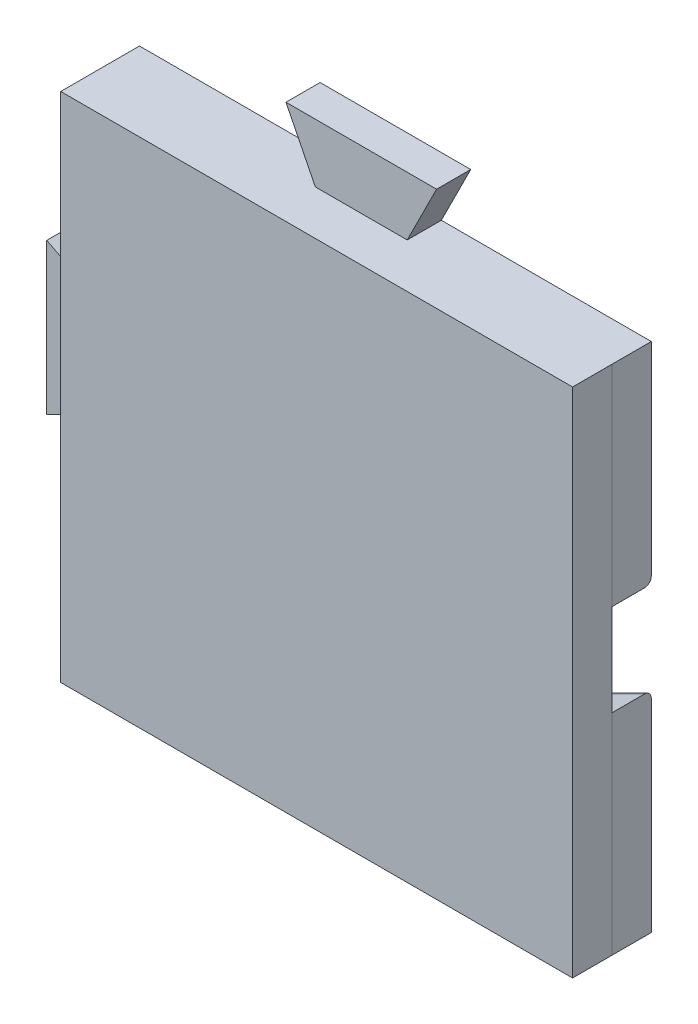
ISO-10303-21;
HEADER;
FILE_DESCRIPTION(('STEP AP214'),'2;1');
FILE_NAME('part.step','',(''),(''),'','','');
FILE_SCHEMA(('AUTOMOTIVE_DESIGN { 1 0 10303 214 1 1 1 1 }'));
ENDSEC;
DATA;
#1=APPLICATION_CONTEXT('core data for automotive mechanical design processes');
#2=APPLICATION_PROTOCOL_DEFINITION('international standard','automotive_design',2000,#1);
#3=PRODUCT_CONTEXT('',#1,'mechanical');
#4=PRODUCT('Part','Part','',(#3));
#5=PRODUCT_RELATED_PRODUCT_CATEGORY('part','',(#4));
#6=PRODUCT_DEFINITION_FORMATION('','',#4);
#7=PRODUCT_DEFINITION_CONTEXT('part definition',#1,'design');
#8=PRODUCT_DEFINITION('design','',#6,#7);
#9=PRODUCT_DEFINITION_SHAPE('','',#8);
#10=(LENGTH_UNIT() NAMED_UNIT(*) SI_UNIT(.MILLI.,.METRE.));
#11=(NAMED_UNIT(*) PLANE_ANGLE_UNIT() SI_UNIT($,.RADIAN.));
#12=(NAMED_UNIT(*) SI_UNIT($,.STERADIAN.) SOLID_ANGLE_UNIT());
#13=UNCERTAINTY_MEASURE_WITH_UNIT(LENGTH_MEASURE(1.E-05),#10,'distance_accuracy_value','');
#14=(GEOMETRIC_REPRESENTATION_CONTEXT(3) GLOBAL_UNCERTAINTY_ASSIGNED_CONTEXT((#13)) GLOBAL_UNIT_ASSIGNED_CONTEXT((#10,
#11,#12)) REPRESENTATION_CONTEXT('',''));
#15=CARTESIAN_POINT('',(0.,0.,0.));
#16=DIRECTION('',(0.,0.,1.));
#17=DIRECTION('',(1.,0.,0.));
#18=AXIS2_PLACEMENT_3D('',#15,#16,#17);
#19=CARTESIAN_POINT('',(17.2646144079016,21.7353855920973,0.));
#20=DIRECTION('',(0.,0.,1.));
#21=DIRECTION('',(1.,0.,0.));
#22=AXIS2_PLACEMENT_3D('',#19,#20,#21);
#23=PLANE('',#22);
#24=CARTESIAN_POINT('',(19.5,19.5,0.));
#25=DIRECTION('',(0.,0.,1.));
#26=DIRECTION('',(1.,0.,0.));
#27=AXIS2_PLACEMENT_3D('',#24,#25,#26);
#28=CIRCLE('',#27,7.57);
#29=CARTESIAN_POINT('',(11.93,19.5,0.));
#30=VERTEX_POINT('',#29);
#31=EDGE_CURVE('E321',#30,#30,#28,.T.);
#32=ORIENTED_EDGE('',*,*,#31,.T.);
#33=EDGE_LOOP('',(#32));
#34=FACE_BOUND('',#33,.T.);
#35=DIRECTION('',(-0.894154236839191,-0.447759087839123,0.));
#36=VECTOR('',#35,1.);
#37=CARTESIAN_POINT('',(31.6831566125795,11.7768102088134,0.));
#38=LINE('',#37,#36);
#39=CARTESIAN_POINT('',(38.9999998356643,15.4408123601777,0.));
#40=VERTEX_POINT('',#39);
#41=CARTESIAN_POINT('',(34.0292285710155,12.9516355318221,0.));
#42=VERTEX_POINT('',#41);
#43=EDGE_CURVE('E384',#40,#42,#38,.T.);
#44=ORIENTED_EDGE('',*,*,#43,.F.);
#45=DIRECTION('',(-1.06429420831944E-08,1.,0.));
#46=VECTOR('',#45,1.);
#47=CARTESIAN_POINT('',(39.,0.,0.));
#48=LINE('',#47,#46);
#49=CARTESIAN_POINT('',(39.,0.,0.));
#50=VERTEX_POINT('',#49);
#51=EDGE_CURVE('E536',#50,#40,#48,.T.);
#52=ORIENTED_EDGE('',*,*,#51,.F.);
#53=DIRECTION('',(1.,0.,0.));
#54=VECTOR('',#53,1.);
#55=CARTESIAN_POINT('',(23.,0.,0.));
#56=LINE('',#55,#54);
#57=CARTESIAN_POINT('',(23.5591876428024,0.,0.));
#58=VERTEX_POINT('',#57);
#59=EDGE_CURVE('E19',#58,#50,#56,.T.);
#60=ORIENTED_EDGE('',*,*,#59,.F.);
#61=DIRECTION('',(-0.44775908783877,-0.894154236839368,0.));
#62=VECTOR('',#61,1.);
#63=CARTESIAN_POINT('',(28.3425875448702,9.5522288773087,0.));
#64=LINE('',#63,#62);
#65=CARTESIAN_POINT('',(26.0483644308682,4.97077118419684,0.));
#66=VERTEX_POINT('',#65);
#67=EDGE_CURVE('E434',#66,#58,#64,.T.);
#68=ORIENTED_EDGE('',*,*,#67,.F.);
#69=DIRECTION('',(1.,0.,0.));
#70=VECTOR('',#69,1.);
#71=CARTESIAN_POINT('',(15.5129096035632,4.97077118419684,0.));
#72=LINE('',#71,#70);
#73=CARTESIAN_POINT('',(12.9516358075504,4.97077118419684,0.));
#74=VERTEX_POINT('',#73);
#75=EDGE_CURVE('E495',#74,#66,#72,.T.);
#76=ORIENTED_EDGE('',*,*,#75,.F.);
#77=DIRECTION('',(-0.44775908783877,0.894154236839368,0.));
#78=VECTOR('',#77,1.);
#79=CARTESIAN_POINT('',(11.3286419539204,8.21181501781761,0.));
#80=LINE('',#79,#78);
#81=CARTESIAN_POINT('',(15.4408125956162,0.,0.));
#82=VERTEX_POINT('',#81);
#83=EDGE_CURVE('E315',#82,#74,#80,.T.);
#84=ORIENTED_EDGE('',*,*,#83,.F.);
#85=DIRECTION('',(1.,0.,0.));
#86=VECTOR('',#85,1.);
#87=CARTESIAN_POINT('',(0.,0.,0.));
#88=LINE('',#87,#86);
#89=CARTESIAN_POINT('',(0.,0.,0.));
#90=VERTEX_POINT('',#89);
#91=EDGE_CURVE('E11',#90,#82,#88,.T.);
#92=ORIENTED_EDGE('',*,*,#91,.F.);
#93=DIRECTION('',(0.,-1.,0.));
#94=VECTOR('',#93,1.);
#95=CARTESIAN_POINT('',(0.,16.,0.));
#96=LINE('',#95,#94);
#97=CARTESIAN_POINT('',(0.,16.,0.));
#98=VERTEX_POINT('',#97);
#99=EDGE_CURVE('E525',#98,#90,#96,.T.);
#100=ORIENTED_EDGE('',*,*,#99,.F.);
#101=DIRECTION('',(-0.894154236839368,-0.447759087838769,0.));
#102=VECTOR('',#101,1.);
#103=CARTESIAN_POINT('',(0.,16.,0.));
#104=LINE('',#103,#102);
#105=CARTESIAN_POINT('',(-4.47077118419684,13.7612045608062,0.));
#106=VERTEX_POINT('',#105);
#107=EDGE_CURVE('E254',#98,#106,#104,.T.);
#108=ORIENTED_EDGE('',*,*,#107,.T.);
#109=DIRECTION('',(0.,1.,0.));
#110=VECTOR('',#109,1.);
#111=CARTESIAN_POINT('',(-4.47077118419684,13.7612045608062,0.));
#112=LINE('',#111,#110);
#113=CARTESIAN_POINT('',(-4.47077118419684,25.2387954391939,0.));
#114=VERTEX_POINT('',#113);
#115=EDGE_CURVE('E349',#106,#114,#112,.T.);
#116=ORIENTED_EDGE('',*,*,#115,.T.);
#117=DIRECTION('',(0.894154236839367,-0.447759087838771,0.));
#118=VECTOR('',#117,1.);
#119=CARTESIAN_POINT('',(-4.47077118419684,25.2387954391939,0.));
#120=LINE('',#119,#118);
#121=CARTESIAN_POINT('',(0.,23.,0.));
#122=VERTEX_POINT('',#121);
#123=EDGE_CURVE('E363',#114,#122,#120,.T.);
#124=ORIENTED_EDGE('',*,*,#123,.T.);
#125=DIRECTION('',(0.,-1.,0.));
#126=VECTOR('',#125,1.);
#127=CARTESIAN_POINT('',(0.,39.,0.));
#128=LINE('',#127,#126);
#129=CARTESIAN_POINT('',(0.,39.,0.));
#130=VERTEX_POINT('',#129);
#131=EDGE_CURVE('E367',#130,#122,#128,.T.);
#132=ORIENTED_EDGE('',*,*,#131,.F.);
#133=DIRECTION('',(-1.,0.,0.));
#134=VECTOR('',#133,1.);
#135=CARTESIAN_POINT('',(16.,39.,0.));
#136=LINE('',#135,#134);
#137=CARTESIAN_POINT('',(16.,39.,0.));
#138=VERTEX_POINT('',#137);
#139=EDGE_CURVE('E466',#138,#130,#136,.T.);
#140=ORIENTED_EDGE('',*,*,#139,.F.);
#141=DIRECTION('',(-0.447759087839646,0.894154236838929,0.));
#142=VECTOR('',#141,1.);
#143=CARTESIAN_POINT('',(16.,39.,0.));
#144=LINE('',#143,#142);
#145=CARTESIAN_POINT('',(13.7612045608018,43.4707711841946,0.));
#146=VERTEX_POINT('',#145);
#147=EDGE_CURVE('E304',#138,#146,#144,.T.);
#148=ORIENTED_EDGE('',*,*,#147,.T.);
#149=DIRECTION('',(1.,0.,0.));
#150=VECTOR('',#149,1.);
#151=CARTESIAN_POINT('',(13.7612045608018,43.4707711841946,0.));
#152=LINE('',#151,#150);
#153=CARTESIAN_POINT('',(25.238795024118,43.4707711841946,0.));
#154=VERTEX_POINT('',#153);
#155=EDGE_CURVE('E46',#146,#154,#152,.T.);
#156=ORIENTED_EDGE('',*,*,#155,.T.);
#157=DIRECTION('',(-0.447759087838771,-0.894154236839368,0.));
#158=VECTOR('',#157,1.);
#159=CARTESIAN_POINT('',(25.238795024118,43.4707711841946,0.));
#160=LINE('',#159,#158);
#161=CARTESIAN_POINT('',(22.9999995849252,39.,0.));
#162=VERTEX_POINT('',#161);
#163=EDGE_CURVE('E291',#154,#162,#160,.T.);
#164=ORIENTED_EDGE('',*,*,#163,.T.);
#165=DIRECTION('',(-1.,0.,0.));
#166=VECTOR('',#165,1.);
#167=CARTESIAN_POINT('',(38.9999995849253,39.,0.));
#168=LINE('',#167,#166);
#169=CARTESIAN_POINT('',(38.9999995849253,39.,0.));
#170=VERTEX_POINT('',#169);
#171=EDGE_CURVE('E288',#170,#162,#168,.T.);
#172=ORIENTED_EDGE('',*,*,#171,.F.);
#173=DIRECTION('',(-1.06429422286385E-08,1.,0.));
#174=VECTOR('',#173,1.);
#175=CARTESIAN_POINT('',(38.9999997552123,22.9999998013909,0.));
#176=LINE('',#175,#174);
#177=CARTESIAN_POINT('',(38.9999997492609,23.5591874471735,0.));
#178=VERTEX_POINT('',#177);
#179=EDGE_CURVE('E484',#178,#170,#176,.T.);
#180=ORIENTED_EDGE('',*,*,#179,.F.);
#181=DIRECTION('',(0.894154236839368,-0.44775908783877,0.));
#182=VECTOR('',#181,1.);
#183=CARTESIAN_POINT('',(28.5527992511206,28.7907557524931,0.));
#184=LINE('',#183,#182);
#185=CARTESIAN_POINT('',(34.0292285710155,26.0483642322591,0.));
#186=VERTEX_POINT('',#185);
#187=EDGE_CURVE('E454',#186,#178,#184,.T.);
#188=ORIENTED_EDGE('',*,*,#187,.F.);
#189=DIRECTION('',(0.,1.,0.));
#190=VECTOR('',#189,1.);
#191=CARTESIAN_POINT('',(34.0292285710155,17.7482950577971,0.));
#192=LINE('',#191,#190);
#193=EDGE_CURVE('E433',#42,#186,#192,.T.);
#194=ORIENTED_EDGE('',*,*,#193,.F.);
#195=EDGE_LOOP('',(#44,#52,#60,#68,#76,#84,#92,#100,#108,#116,#124,#132,#140,#148,#156,#164,
#172,#180,#188,#194));
#196=FACE_BOUND('',#195,.T.);
#197=ADVANCED_FACE('F16',(#34,#196),#23,.F.);
#198=CARTESIAN_POINT('',(0.,0.,0.));
#199=DIRECTION('',(0.,-1.,0.));
#200=DIRECTION('',(0.,0.,-1.));
#201=AXIS2_PLACEMENT_3D('',#198,#199,#200);
#202=PLANE('',#201);
#203=CARTESIAN_POINT('',(15.4408125956162,0.,0.5));
#204=DIRECTION('',(0.,1.,0.));
#205=DIRECTION('',(1.,0.,0.));
#206=AXIS2_PLACEMENT_3D('',#203,#204,#205);
#207=ELLIPSE('',#206,0.559187642802417,0.5);
#208=CARTESIAN_POINT('',(16.0000002384186,0.,0.5));
#209=VERTEX_POINT('',#208);
#210=EDGE_CURVE('E339',#209,#82,#207,.T.);
#211=ORIENTED_EDGE('',*,*,#210,.F.);
#212=DIRECTION('',(0.,0.,1.));
#213=VECTOR('',#212,1.);
#214=CARTESIAN_POINT('',(16.0000002384186,0.,0.));
#215=LINE('',#214,#213);
#216=CARTESIAN_POINT('',(16.0000002384186,0.,3.));
#217=VERTEX_POINT('',#216);
#218=EDGE_CURVE('E491',#209,#217,#215,.T.);
#219=ORIENTED_EDGE('',*,*,#218,.T.);
#220=DIRECTION('',(-1.,0.,0.));
#221=VECTOR('',#220,1.);
#222=CARTESIAN_POINT('',(39.,0.,3.));
#223=LINE('',#222,#221);
#224=CARTESIAN_POINT('',(23.,0.,3.));
#225=VERTEX_POINT('',#224);
#226=EDGE_CURVE('E368',#225,#217,#223,.T.);
#227=ORIENTED_EDGE('',*,*,#226,.F.);
#228=DIRECTION('',(0.,0.,1.));
#229=VECTOR('',#228,1.);
#230=CARTESIAN_POINT('',(23.,0.,0.));
#231=LINE('',#230,#229);
#232=CARTESIAN_POINT('',(23.,0.,0.5));
#233=VERTEX_POINT('',#232);
#234=EDGE_CURVE('E350',#233,#225,#231,.T.);
#235=ORIENTED_EDGE('',*,*,#234,.F.);
#236=CARTESIAN_POINT('',(23.5591876428024,0.,0.5));
#237=DIRECTION('',(0.,1.,0.));
#238=DIRECTION('',(-1.,0.,0.));
#239=AXIS2_PLACEMENT_3D('',#236,#237,#238);
#240=ELLIPSE('',#239,0.559187642802417,0.5);
#241=EDGE_CURVE('E438',#58,#233,#240,.T.);
#242=ORIENTED_EDGE('',*,*,#241,.F.);
#243=ORIENTED_EDGE('',*,*,#59,.T.);
#244=DIRECTION('',(0.,0.,1.));
#245=VECTOR('',#244,1.);
#246=CARTESIAN_POINT('',(39.,0.,0.));
#247=LINE('',#246,#245);
#248=CARTESIAN_POINT('',(39.,0.,3.));
#249=VERTEX_POINT('',#248);
#250=EDGE_CURVE('E528',#50,#249,#247,.T.);
#251=ORIENTED_EDGE('',*,*,#250,.T.);
#252=DIRECTION('',(0.,0.,1.));
#253=VECTOR('',#252,1.);
#254=CARTESIAN_POINT('',(39.,0.,3.));
#255=LINE('',#254,#253);
#256=CARTESIAN_POINT('',(39.,0.,6.));
#257=VERTEX_POINT('',#256);
#258=EDGE_CURVE('E401',#249,#257,#255,.T.);
#259=ORIENTED_EDGE('',*,*,#258,.T.);
#260=DIRECTION('',(1.,0.,0.));
#261=VECTOR('',#260,1.);
#262=CARTESIAN_POINT('',(39.,0.,6.));
#263=LINE('',#262,#261);
#264=CARTESIAN_POINT('',(0.,0.,6.));
#265=VERTEX_POINT('',#264);
#266=EDGE_CURVE('E407',#265,#257,#263,.T.);
#267=ORIENTED_EDGE('',*,*,#266,.F.);
#268=DIRECTION('',(0.,0.,1.));
#269=VECTOR('',#268,1.);
#270=CARTESIAN_POINT('',(0.,0.,0.));
#271=LINE('',#270,#269);
#272=EDGE_CURVE('E531',#90,#265,#271,.T.);
#273=ORIENTED_EDGE('',*,*,#272,.F.);
#274=ORIENTED_EDGE('',*,*,#91,.T.);
#275=EDGE_LOOP('',(#211,#219,#227,#235,#242,#243,#251,#259,#267,#273,#274));
#276=FACE_BOUND('',#275,.T.);
#277=ADVANCED_FACE('F560',(#276),#202,.T.);
#278=CARTESIAN_POINT('',(39.,0.,0.));
#279=DIRECTION('',(1.,1.06429420831944E-08,0.));
#280=DIRECTION('',(0.,0.,-1.));
#281=AXIS2_PLACEMENT_3D('',#278,#279,#280);
#282=PLANE('',#281);
#283=CARTESIAN_POINT('',(38.9999998356643,15.4408123601777,0.5));
#284=DIRECTION('',(-1.,-1.06429420730383E-08,0.));
#285=DIRECTION('',(-1.06429420730383E-08,1.,0.));
#286=AXIS2_PLACEMENT_3D('',#283,#284,#285);
#287=ELLIPSE('',#286,0.559187639822287,0.5);
#288=CARTESIAN_POINT('',(38.9999998297129,16.,0.5));
#289=VERTEX_POINT('',#288);
#290=EDGE_CURVE('E389',#289,#40,#287,.T.);
#291=ORIENTED_EDGE('',*,*,#290,.F.);
#292=DIRECTION('',(0.,0.,1.));
#293=VECTOR('',#292,1.);
#294=CARTESIAN_POINT('',(38.9999998297129,16.,0.));
#295=LINE('',#294,#293);
#296=CARTESIAN_POINT('',(38.9999998297129,16.,3.));
#297=VERTEX_POINT('',#296);
#298=EDGE_CURVE('E458',#289,#297,#295,.T.);
#299=ORIENTED_EDGE('',*,*,#298,.T.);
#300=DIRECTION('',(-1.06429420831944E-08,1.,0.));
#301=VECTOR('',#300,1.);
#302=CARTESIAN_POINT('',(39.,0.,3.));
#303=LINE('',#302,#301);
#304=EDGE_CURVE('E411',#249,#297,#303,.T.);
#305=ORIENTED_EDGE('',*,*,#304,.F.);
#306=ORIENTED_EDGE('',*,*,#250,.F.);
#307=ORIENTED_EDGE('',*,*,#51,.T.);
#308=EDGE_LOOP('',(#291,#299,#305,#306,#307));
#309=FACE_BOUND('',#308,.T.);
#310=ADVANCED_FACE('F568',(#309),#282,.T.);
#311=CARTESIAN_POINT('',(25.238795024118,43.4707711841946,0.));
#312=DIRECTION('',(0.,1.,0.));
#313=DIRECTION('',(1.,0.,0.));
#314=AXIS2_PLACEMENT_3D('',#311,#312,#313);
#315=PLANE('',#314);
#316=DIRECTION('',(1.,0.,0.));
#317=VECTOR('',#316,1.);
#318=CARTESIAN_POINT('',(22.3693974082889,43.4707711841946,2.6));
#319=LINE('',#318,#317);
#320=CARTESIAN_POINT('',(13.7612045608018,43.4707711841946,2.6));
#321=VERTEX_POINT('',#320);
#322=CARTESIAN_POINT('',(25.238795024118,43.4707711841946,2.6));
#323=VERTEX_POINT('',#322);
#324=EDGE_CURVE('E302',#321,#323,#319,.T.);
#325=ORIENTED_EDGE('',*,*,#324,.T.);
#326=DIRECTION('',(0.,0.,1.));
#327=VECTOR('',#326,1.);
#328=CARTESIAN_POINT('',(25.238795024118,43.4707711841946,0.));
#329=LINE('',#328,#327);
#330=EDGE_CURVE('E325',#154,#323,#329,.T.);
#331=ORIENTED_EDGE('',*,*,#330,.F.);
#332=ORIENTED_EDGE('',*,*,#155,.F.);
#333=DIRECTION('',(0.,0.,1.));
#334=VECTOR('',#333,1.);
#335=CARTESIAN_POINT('',(13.7612045608018,43.4707711841946,0.));
#336=LINE('',#335,#334);
#337=EDGE_CURVE('E287',#146,#321,#336,.T.);
#338=ORIENTED_EDGE('',*,*,#337,.T.);
#339=EDGE_LOOP('',(#325,#331,#332,#338));
#340=FACE_BOUND('',#339,.T.);
#341=ADVANCED_FACE('F575',(#340),#315,.T.);
#342=CARTESIAN_POINT('',(13.7612045608018,43.4707711841946,0.));
#343=DIRECTION('',(-0.894154236838929,-0.447759087839646,0.));
#344=DIRECTION('',(-0.447759087839646,0.894154236838929,0.));
#345=AXIS2_PLACEMENT_3D('',#342,#343,#344);
#346=PLANE('',#345);
#347=DIRECTION('',(-0.447759087839646,0.894154236838929,0.));
#348=VECTOR('',#347,1.);
#349=CARTESIAN_POINT('',(14.783970768456,41.4283542624476,2.6));
#350=LINE('',#349,#348);
#351=CARTESIAN_POINT('',(16.,39.,2.6));
#352=VERTEX_POINT('',#351);
#353=EDGE_CURVE('E294',#352,#321,#350,.T.);
#354=ORIENTED_EDGE('',*,*,#353,.T.);
#355=ORIENTED_EDGE('',*,*,#337,.F.);
#356=ORIENTED_EDGE('',*,*,#147,.F.);
#357=DIRECTION('',(0.,0.,1.));
#358=VECTOR('',#357,1.);
#359=CARTESIAN_POINT('',(16.,39.,0.));
#360=LINE('',#359,#358);
#361=EDGE_CURVE('E284',#138,#352,#360,.T.);
#362=ORIENTED_EDGE('',*,*,#361,.T.);
#363=EDGE_LOOP('',(#354,#355,#356,#362));
#364=FACE_BOUND('',#363,.T.);
#365=ADVANCED_FACE('F584',(#364),#346,.T.);
#366=CARTESIAN_POINT('',(16.,39.,0.));
#367=DIRECTION('',(0.,1.,0.));
#368=DIRECTION('',(1.,0.,0.));
#369=AXIS2_PLACEMENT_3D('',#366,#367,#368);
#370=PLANE('',#369);
#371=ORIENTED_EDGE('',*,*,#139,.T.);
#372=DIRECTION('',(0.,0.,1.));
#373=VECTOR('',#372,1.);
#374=CARTESIAN_POINT('',(0.,39.,0.));
#375=LINE('',#374,#373);
#376=CARTESIAN_POINT('',(0.,39.,6.));
#377=VERTEX_POINT('',#376);
#378=EDGE_CURVE('E481',#130,#377,#375,.T.);
#379=ORIENTED_EDGE('',*,*,#378,.T.);
#380=DIRECTION('',(-1.,0.,0.));
#381=VECTOR('',#380,1.);
#382=CARTESIAN_POINT('',(0.,39.,6.));
#383=LINE('',#382,#381);
#384=CARTESIAN_POINT('',(39.,39.,6.));
#385=VERTEX_POINT('',#384);
#386=EDGE_CURVE('E402',#385,#377,#383,.T.);
#387=ORIENTED_EDGE('',*,*,#386,.F.);
#388=DIRECTION('',(0.,0.,1.));
#389=VECTOR('',#388,1.);
#390=CARTESIAN_POINT('',(39.,39.,3.));
#391=LINE('',#390,#389);
#392=CARTESIAN_POINT('',(38.9999995849253,39.,3.));
#393=VERTEX_POINT('',#392);
#394=EDGE_CURVE('E393',#393,#385,#391,.T.);
#395=ORIENTED_EDGE('',*,*,#394,.F.);
#396=DIRECTION('',(0.,0.,1.));
#397=VECTOR('',#396,1.);
#398=CARTESIAN_POINT('',(38.9999995849253,39.,0.));
#399=LINE('',#398,#397);
#400=EDGE_CURVE('E340',#170,#393,#399,.T.);
#401=ORIENTED_EDGE('',*,*,#400,.F.);
#402=ORIENTED_EDGE('',*,*,#171,.T.);
#403=DIRECTION('',(0.,0.,1.));
#404=VECTOR('',#403,1.);
#405=CARTESIAN_POINT('',(22.9999995849252,39.,0.));
#406=LINE('',#405,#404);
#407=CARTESIAN_POINT('',(22.9999995849252,39.,2.6));
#408=VERTEX_POINT('',#407);
#409=EDGE_CURVE('E258',#162,#408,#406,.T.);
#410=ORIENTED_EDGE('',*,*,#409,.T.);
#411=DIRECTION('',(-1.,0.,0.));
#412=VECTOR('',#411,1.);
#413=CARTESIAN_POINT('',(0.,39.,2.6));
#414=LINE('',#413,#412);
#415=EDGE_CURVE('E303',#408,#352,#414,.T.);
#416=ORIENTED_EDGE('',*,*,#415,.T.);
#417=ORIENTED_EDGE('',*,*,#361,.F.);
#418=EDGE_LOOP('',(#371,#379,#387,#395,#401,#402,#410,#416,#417));
#419=FACE_BOUND('',#418,.T.);
#420=ADVANCED_FACE('F580',(#419),#370,.T.);
#421=CARTESIAN_POINT('',(0.,39.,0.));
#422=DIRECTION('',(-1.,0.,0.));
#423=DIRECTION('',(0.,1.,0.));
#424=AXIS2_PLACEMENT_3D('',#421,#422,#423);
#425=PLANE('',#424);
#426=ORIENTED_EDGE('',*,*,#131,.T.);
#427=DIRECTION('',(0.,0.,1.));
#428=VECTOR('',#427,1.);
#429=CARTESIAN_POINT('',(0.,23.,0.));
#430=LINE('',#429,#428);
#431=CARTESIAN_POINT('',(0.,23.,2.6));
#432=VERTEX_POINT('',#431);
#433=EDGE_CURVE('E264',#122,#432,#430,.T.);
#434=ORIENTED_EDGE('',*,*,#433,.T.);
#435=DIRECTION('',(0.,-1.,0.));
#436=VECTOR('',#435,1.);
#437=CARTESIAN_POINT('',(0.,0.,2.6));
#438=LINE('',#437,#436);
#439=CARTESIAN_POINT('',(0.,16.,2.6));
#440=VERTEX_POINT('',#439);
#441=EDGE_CURVE('E261',#432,#440,#438,.T.);
#442=ORIENTED_EDGE('',*,*,#441,.T.);
#443=DIRECTION('',(0.,0.,1.));
#444=VECTOR('',#443,1.);
#445=CARTESIAN_POINT('',(0.,16.,0.));
#446=LINE('',#445,#444);
#447=EDGE_CURVE('E247',#98,#440,#446,.T.);
#448=ORIENTED_EDGE('',*,*,#447,.F.);
#449=ORIENTED_EDGE('',*,*,#99,.T.);
#450=ORIENTED_EDGE('',*,*,#272,.T.);
#451=DIRECTION('',(0.,-1.,0.));
#452=VECTOR('',#451,1.);
#453=CARTESIAN_POINT('',(0.,0.,6.));
#454=LINE('',#453,#452);
#455=EDGE_CURVE('E406',#377,#265,#454,.T.);
#456=ORIENTED_EDGE('',*,*,#455,.F.);
#457=ORIENTED_EDGE('',*,*,#378,.F.);
#458=EDGE_LOOP('',(#426,#434,#442,#448,#449,#450,#456,#457));
#459=FACE_BOUND('',#458,.T.);
#460=ADVANCED_FACE('F262',(#459),#425,.T.);
#461=CARTESIAN_POINT('',(0.,23.,0.));
#462=DIRECTION('',(0.447759087838771,0.894154236839368,0.));
#463=DIRECTION('',(0.,0.,-1.));
#464=AXIS2_PLACEMENT_3D('',#461,#462,#463);
#465=PLANE('',#464);
#466=DIRECTION('',(0.894154236839367,-0.447759087838771,0.));
#467=VECTOR('',#466,1.);
#468=CARTESIAN_POINT('',(-0.192968628806632,23.0966314911411,2.6));
#469=LINE('',#468,#467);
#470=CARTESIAN_POINT('',(-4.47077118419684,25.2387954391939,2.6));
#471=VERTEX_POINT('',#470);
#472=EDGE_CURVE('E269',#471,#432,#469,.T.);
#473=ORIENTED_EDGE('',*,*,#472,.T.);
#474=ORIENTED_EDGE('',*,*,#433,.F.);
#475=ORIENTED_EDGE('',*,*,#123,.F.);
#476=DIRECTION('',(0.,0.,1.));
#477=VECTOR('',#476,1.);
#478=CARTESIAN_POINT('',(-4.47077118419684,25.2387954391939,0.));
#479=LINE('',#478,#477);
#480=EDGE_CURVE('E346',#114,#471,#479,.T.);
#481=ORIENTED_EDGE('',*,*,#480,.T.);
#482=EDGE_LOOP('',(#473,#474,#475,#481));
#483=FACE_BOUND('',#482,.T.);
#484=ADVANCED_FACE('F593',(#483),#465,.T.);
#485=CARTESIAN_POINT('',(-4.47077118419684,25.2387954391939,0.));
#486=DIRECTION('',(-1.,0.,0.));
#487=DIRECTION('',(0.,1.,0.));
#488=AXIS2_PLACEMENT_3D('',#485,#486,#487);
#489=PLANE('',#488);
#490=DIRECTION('',(0.,1.,0.));
#491=VECTOR('',#490,1.);
#492=CARTESIAN_POINT('',(-4.47077118419684,22.3693977195969,2.6));
#493=LINE('',#492,#491);
#494=CARTESIAN_POINT('',(-4.47077118419684,13.7612045608062,2.6));
#495=VERTEX_POINT('',#494);
#496=EDGE_CURVE('E274',#495,#471,#493,.T.);
#497=ORIENTED_EDGE('',*,*,#496,.T.);
#498=ORIENTED_EDGE('',*,*,#480,.F.);
#499=ORIENTED_EDGE('',*,*,#115,.F.);
#500=DIRECTION('',(0.,0.,1.));
#501=VECTOR('',#500,1.);
#502=CARTESIAN_POINT('',(-4.47077118419684,13.7612045608062,0.));
#503=LINE('',#502,#501);
#504=EDGE_CURVE('E297',#106,#495,#503,.T.);
#505=ORIENTED_EDGE('',*,*,#504,.T.);
#506=EDGE_LOOP('',(#497,#498,#499,#505));
#507=FACE_BOUND('',#506,.T.);
#508=ADVANCED_FACE('F601',(#507),#489,.T.);
#509=CARTESIAN_POINT('',(25.2387954391939,4.47077118419684,0.));
#510=DIRECTION('',(-0.894154236839368,0.44775908783877,0.));
#511=DIRECTION('',(0.,0.,1.));
#512=AXIS2_PLACEMENT_3D('',#509,#510,#511);
#513=PLANE('',#512);
#514=DIRECTION('',(0.44775908783877,0.894154236839368,0.));
#515=VECTOR('',#514,1.);
#516=CARTESIAN_POINT('',(27.8955104264505,9.77610842122809,0.5));
#517=LINE('',#516,#515);
#518=CARTESIAN_POINT('',(25.2387954391939,4.47077118419684,0.5));
#519=VERTEX_POINT('',#518);
#520=EDGE_CURVE('E510',#233,#519,#517,.T.);
#521=ORIENTED_EDGE('',*,*,#520,.F.);
#522=ORIENTED_EDGE('',*,*,#234,.T.);
#523=DIRECTION('',(-0.44775908783877,-0.894154236839368,0.));
#524=VECTOR('',#523,1.);
#525=CARTESIAN_POINT('',(25.2387954391939,4.47077118419684,3.));
#526=LINE('',#525,#524);
#527=CARTESIAN_POINT('',(25.2387954391939,4.47077118419684,3.));
#528=VERTEX_POINT('',#527);
#529=EDGE_CURVE('E373',#528,#225,#526,.T.);
#530=ORIENTED_EDGE('',*,*,#529,.F.);
#531=DIRECTION('',(0.,0.,1.));
#532=VECTOR('',#531,1.);
#533=CARTESIAN_POINT('',(25.2387954391939,4.47077118419684,0.));
#534=LINE('',#533,#532);
#535=EDGE_CURVE('E488',#519,#528,#534,.T.);
#536=ORIENTED_EDGE('',*,*,#535,.F.);
#537=EDGE_LOOP('',(#521,#522,#530,#536));
#538=FACE_BOUND('',#537,.T.);
#539=ADVANCED_FACE('F610',(#538),#513,.T.);
#540=CARTESIAN_POINT('',(13.7612047992247,4.47077118419684,0.));
#541=DIRECTION('',(0.,-1.,0.));
#542=DIRECTION('',(0.,0.,-1.));
#543=AXIS2_PLACEMENT_3D('',#540,#541,#542);
#544=PLANE('',#543);
#545=DIRECTION('',(-1.,0.,0.));
#546=VECTOR('',#545,1.);
#547=CARTESIAN_POINT('',(15.5129096035632,4.47077118419684,0.5));
#548=LINE('',#547,#546);
#549=CARTESIAN_POINT('',(13.7612047992247,4.47077118419684,0.5));
#550=VERTEX_POINT('',#549);
#551=EDGE_CURVE('E314',#519,#550,#548,.T.);
#552=ORIENTED_EDGE('',*,*,#551,.F.);
#553=ORIENTED_EDGE('',*,*,#535,.T.);
#554=DIRECTION('',(1.,0.,0.));
#555=VECTOR('',#554,1.);
#556=CARTESIAN_POINT('',(13.7612047992247,4.47077118419684,3.));
#557=LINE('',#556,#555);
#558=CARTESIAN_POINT('',(13.7612047992247,4.47077118419684,3.));
#559=VERTEX_POINT('',#558);
#560=EDGE_CURVE('E377',#559,#528,#557,.T.);
#561=ORIENTED_EDGE('',*,*,#560,.F.);
#562=DIRECTION('',(0.,0.,1.));
#563=VECTOR('',#562,1.);
#564=CARTESIAN_POINT('',(13.7612047992247,4.47077118419684,0.));
#565=LINE('',#564,#563);
#566=EDGE_CURVE('E514',#550,#559,#565,.T.);
#567=ORIENTED_EDGE('',*,*,#566,.F.);
#568=EDGE_LOOP('',(#552,#553,#561,#567));
#569=FACE_BOUND('',#568,.T.);
#570=ADVANCED_FACE('F616',(#569),#544,.T.);
#571=CARTESIAN_POINT('',(16.0000002384186,0.,0.));
#572=DIRECTION('',(0.894154236839368,0.44775908783877,0.));
#573=DIRECTION('',(0.,0.,-1.));
#574=AXIS2_PLACEMENT_3D('',#571,#572,#573);
#575=PLANE('',#574);
#576=DIRECTION('',(0.44775908783877,-0.894154236839368,0.));
#577=VECTOR('',#576,1.);
#578=CARTESIAN_POINT('',(11.7757190723401,8.43569456173699,0.5));
#579=LINE('',#578,#577);
#580=EDGE_CURVE('E335',#550,#209,#579,.T.);
#581=ORIENTED_EDGE('',*,*,#580,.F.);
#582=ORIENTED_EDGE('',*,*,#566,.T.);
#583=DIRECTION('',(-0.44775908783877,0.894154236839368,0.));
#584=VECTOR('',#583,1.);
#585=CARTESIAN_POINT('',(16.0000002384186,0.,3.));
#586=LINE('',#585,#584);
#587=EDGE_CURVE('E359',#217,#559,#586,.T.);
#588=ORIENTED_EDGE('',*,*,#587,.F.);
#589=ORIENTED_EDGE('',*,*,#218,.F.);
#590=EDGE_LOOP('',(#581,#582,#588,#589));
#591=FACE_BOUND('',#590,.T.);
#592=ADVANCED_FACE('F620',(#591),#575,.T.);
#593=CARTESIAN_POINT('',(28.3425875448702,9.5522288773087,0.5));
#594=DIRECTION('',(-0.44775908783877,-0.894154236839368,0.));
#595=DIRECTION('',(-0.632262524295799,0.316613487348698,-0.707106781186548));
#596=AXIS2_PLACEMENT_3D('',#593,#594,#595);
#597=CYLINDRICAL_SURFACE('',#596,0.5);
#598=ORIENTED_EDGE('',*,*,#67,.T.);
#599=ORIENTED_EDGE('',*,*,#241,.T.);
#600=ORIENTED_EDGE('',*,*,#520,.T.);
#601=CARTESIAN_POINT('',(26.0483644308682,4.97077118419684,0.5));
#602=DIRECTION('',(-0.525471651072268,0.850811109424051,0.));
#603=DIRECTION('',(-0.850811109424051,-0.525471651072268,0.));
#604=AXIS2_PLACEMENT_3D('',#601,#602,#603);
#605=ELLIPSE('',#604,0.951526117497888,0.5);
#606=EDGE_CURVE('E439',#66,#519,#605,.T.);
#607=ORIENTED_EDGE('',*,*,#606,.F.);
#608=EDGE_LOOP('',(#598,#599,#600,#607));
#609=FACE_BOUND('',#608,.T.);
#610=ADVANCED_FACE('F629',(#609),#597,.T.);
#611=CARTESIAN_POINT('',(15.5129096035632,4.97077118419684,0.5));
#612=DIRECTION('',(1.,0.,0.));
#613=DIRECTION('',(0.,-0.707106781186548,-0.707106781186547));
#614=AXIS2_PLACEMENT_3D('',#611,#612,#613);
#615=CYLINDRICAL_SURFACE('',#614,0.5);
#616=ORIENTED_EDGE('',*,*,#551,.T.);
#617=CARTESIAN_POINT('',(12.9516358075504,4.97077118419684,0.5));
#618=DIRECTION('',(-0.525471651072267,-0.850811109424052,0.));
#619=DIRECTION('',(0.850811109424052,-0.525471651072267,0.));
#620=AXIS2_PLACEMENT_3D('',#617,#618,#619);
#621=ELLIPSE('',#620,0.951526117497888,0.5);
#622=EDGE_CURVE('E310',#74,#550,#621,.T.);
#623=ORIENTED_EDGE('',*,*,#622,.F.);
#624=ORIENTED_EDGE('',*,*,#75,.T.);
#625=ORIENTED_EDGE('',*,*,#606,.T.);
#626=EDGE_LOOP('',(#616,#623,#624,#625));
#627=FACE_BOUND('',#626,.T.);
#628=ADVANCED_FACE('F638',(#627),#615,.T.);
#629=CARTESIAN_POINT('',(11.3286419539204,8.21181501781761,0.5));
#630=DIRECTION('',(-0.44775908783877,0.894154236839368,0.));
#631=DIRECTION('',(0.632262524295799,0.316613487348698,-0.707106781186548));
#632=AXIS2_PLACEMENT_3D('',#629,#630,#631);
#633=CYLINDRICAL_SURFACE('',#632,0.5);
#634=ORIENTED_EDGE('',*,*,#580,.T.);
#635=ORIENTED_EDGE('',*,*,#210,.T.);
#636=ORIENTED_EDGE('',*,*,#83,.T.);
#637=ORIENTED_EDGE('',*,*,#622,.T.);
#638=EDGE_LOOP('',(#634,#635,#636,#637));
#639=FACE_BOUND('',#638,.T.);
#640=ADVANCED_FACE('F647',(#639),#633,.T.);
#641=CARTESIAN_POINT('',(38.9999997552123,22.9999998013909,0.));
#642=DIRECTION('',(1.,1.06429422286385E-08,0.));
#643=DIRECTION('',(0.,0.,-1.));
#644=AXIS2_PLACEMENT_3D('',#641,#642,#643);
#645=PLANE('',#644);
#646=CARTESIAN_POINT('',(38.9999997492609,23.5591874471735,0.5));
#647=DIRECTION('',(-1.,-1.06429422228275E-08,0.));
#648=DIRECTION('',(1.06429422228275E-08,-1.,0.));
#649=AXIS2_PLACEMENT_3D('',#646,#647,#648);
#650=ELLIPSE('',#649,0.559187645782657,0.5);
#651=CARTESIAN_POINT('',(38.9999997552123,22.9999998013909,0.5));
#652=VERTEX_POINT('',#651);
#653=EDGE_CURVE('E463',#178,#652,#650,.T.);
#654=ORIENTED_EDGE('',*,*,#653,.F.);
#655=ORIENTED_EDGE('',*,*,#179,.T.);
#656=ORIENTED_EDGE('',*,*,#400,.T.);
#657=DIRECTION('',(-1.06429422286385E-08,1.,0.));
#658=VECTOR('',#657,1.);
#659=CARTESIAN_POINT('',(38.9999997552123,22.9999998013909,3.));
#660=LINE('',#659,#658);
#661=CARTESIAN_POINT('',(38.9999997552123,22.9999998013909,3.));
#662=VERTEX_POINT('',#661);
#663=EDGE_CURVE('E372',#662,#393,#660,.T.);
#664=ORIENTED_EDGE('',*,*,#663,.F.);
#665=DIRECTION('',(0.,0.,1.));
#666=VECTOR('',#665,1.);
#667=CARTESIAN_POINT('',(38.9999997552123,22.9999998013909,0.));
#668=LINE('',#667,#666);
#669=EDGE_CURVE('E478',#652,#662,#668,.T.);
#670=ORIENTED_EDGE('',*,*,#669,.F.);
#671=EDGE_LOOP('',(#654,#655,#656,#664,#670));
#672=FACE_BOUND('',#671,.T.);
#673=ADVANCED_FACE('F656',(#672),#645,.T.);
#674=CARTESIAN_POINT('',(34.5292285710155,25.2387952405847,0.));
#675=DIRECTION('',(-0.44775908783877,-0.894154236839368,0.));
#676=DIRECTION('',(-0.894154236839368,0.44775908783877,0.));
#677=AXIS2_PLACEMENT_3D('',#674,#675,#676);
#678=PLANE('',#677);
#679=DIRECTION('',(-0.894154236839368,0.44775908783877,0.));
#680=VECTOR('',#679,1.);
#681=CARTESIAN_POINT('',(28.3289197072012,28.3436786340734,0.5));
#682=LINE('',#681,#680);
#683=CARTESIAN_POINT('',(34.5292285710155,25.2387952405847,0.5));
#684=VERTEX_POINT('',#683);
#685=EDGE_CURVE('E459',#652,#684,#682,.T.);
#686=ORIENTED_EDGE('',*,*,#685,.F.);
#687=ORIENTED_EDGE('',*,*,#669,.T.);
#688=DIRECTION('',(0.894154236839368,-0.44775908783877,0.));
#689=VECTOR('',#688,1.);
#690=CARTESIAN_POINT('',(38.9999997552123,22.9999998013909,3.));
#691=LINE('',#690,#689);
#692=CARTESIAN_POINT('',(34.5292285710155,25.2387952405847,3.));
#693=VERTEX_POINT('',#692);
#694=EDGE_CURVE('E341',#693,#662,#691,.T.);
#695=ORIENTED_EDGE('',*,*,#694,.F.);
#696=DIRECTION('',(0.,0.,1.));
#697=VECTOR('',#696,1.);
#698=CARTESIAN_POINT('',(34.5292285710155,25.2387952405847,0.));
#699=LINE('',#698,#697);
#700=EDGE_CURVE('E475',#684,#693,#699,.T.);
#701=ORIENTED_EDGE('',*,*,#700,.F.);
#702=EDGE_LOOP('',(#686,#687,#695,#701));
#703=FACE_BOUND('',#702,.T.);
#704=ADVANCED_FACE('F665',(#703),#678,.T.);
#705=CARTESIAN_POINT('',(34.5292285710155,13.7612045234968,0.));
#706=DIRECTION('',(1.,0.,0.));
#707=DIRECTION('',(0.,1.,0.));
#708=AXIS2_PLACEMENT_3D('',#705,#706,#707);
#709=PLANE('',#708);
#710=DIRECTION('',(0.,-1.,0.));
#711=VECTOR('',#710,1.);
#712=CARTESIAN_POINT('',(34.5292285710155,17.7482950577971,0.5));
#713=LINE('',#712,#711);
#714=CARTESIAN_POINT('',(34.5292285710155,13.7612045234968,0.5));
#715=VERTEX_POINT('',#714);
#716=EDGE_CURVE('E447',#684,#715,#713,.T.);
#717=ORIENTED_EDGE('',*,*,#716,.F.);
#718=ORIENTED_EDGE('',*,*,#700,.T.);
#719=DIRECTION('',(0.,1.,0.));
#720=VECTOR('',#719,1.);
#721=CARTESIAN_POINT('',(34.5292285710155,25.2387952405847,3.));
#722=LINE('',#721,#720);
#723=CARTESIAN_POINT('',(34.5292285710155,13.7612045234968,3.));
#724=VERTEX_POINT('',#723);
#725=EDGE_CURVE('E355',#724,#693,#722,.T.);
#726=ORIENTED_EDGE('',*,*,#725,.F.);
#727=DIRECTION('',(0.,0.,1.));
#728=VECTOR('',#727,1.);
#729=CARTESIAN_POINT('',(34.5292285710155,13.7612045234968,0.));
#730=LINE('',#729,#728);
#731=EDGE_CURVE('E455',#715,#724,#730,.T.);
#732=ORIENTED_EDGE('',*,*,#731,.F.);
#733=EDGE_LOOP('',(#717,#718,#726,#732));
#734=FACE_BOUND('',#733,.T.);
#735=ADVANCED_FACE('F674',(#734),#709,.T.);
#736=CARTESIAN_POINT('',(38.9999998297129,16.,0.));
#737=DIRECTION('',(-0.447759087839123,0.894154236839191,0.));
#738=DIRECTION('',(0.,0.,1.));
#739=AXIS2_PLACEMENT_3D('',#736,#737,#738);
#740=PLANE('',#739);
#741=DIRECTION('',(0.894154236839191,0.447759087839123,0.));
#742=VECTOR('',#741,1.);
#743=CARTESIAN_POINT('',(31.45927706866,12.223887327233,0.5));
#744=LINE('',#743,#742);
#745=EDGE_CURVE('E420',#715,#289,#744,.T.);
#746=ORIENTED_EDGE('',*,*,#745,.F.);
#747=ORIENTED_EDGE('',*,*,#731,.T.);
#748=DIRECTION('',(-0.894154236839191,-0.447759087839123,0.));
#749=VECTOR('',#748,1.);
#750=CARTESIAN_POINT('',(34.5292285710155,13.7612045234968,3.));
#751=LINE('',#750,#749);
#752=EDGE_CURVE('E354',#297,#724,#751,.T.);
#753=ORIENTED_EDGE('',*,*,#752,.F.);
#754=ORIENTED_EDGE('',*,*,#298,.F.);
#755=EDGE_LOOP('',(#746,#747,#753,#754));
#756=FACE_BOUND('',#755,.T.);
#757=ADVANCED_FACE('F680',(#756),#740,.T.);
#758=CARTESIAN_POINT('',(28.5527992511206,28.7907557524931,0.5));
#759=DIRECTION('',(-0.89415423683937,0.447759087838767,0.));
#760=DIRECTION('',(-0.316613487348692,-0.6322625242958,-0.707106781186549));
#761=AXIS2_PLACEMENT_3D('',#758,#759,#760);
#762=CYLINDRICAL_SURFACE('',#761,0.5);
#763=ORIENTED_EDGE('',*,*,#187,.T.);
#764=ORIENTED_EDGE('',*,*,#653,.T.);
#765=ORIENTED_EDGE('',*,*,#685,.T.);
#766=CARTESIAN_POINT('',(34.0292285710155,26.0483642322591,0.5));
#767=DIRECTION('',(-0.850811109424052,-0.525471651072266,0.));
#768=DIRECTION('',(-0.525471651072266,0.850811109424052,0.));
#769=AXIS2_PLACEMENT_3D('',#766,#767,#768);
#770=ELLIPSE('',#769,0.951526117497892,0.5);
#771=EDGE_CURVE('E443',#186,#684,#770,.T.);
#772=ORIENTED_EDGE('',*,*,#771,.F.);
#773=EDGE_LOOP('',(#763,#764,#765,#772));
#774=FACE_BOUND('',#773,.T.);
#775=ADVANCED_FACE('F684',(#774),#762,.T.);
#776=CARTESIAN_POINT('',(34.0292285710155,17.7482950577971,0.5));
#777=DIRECTION('',(0.,-1.,0.));
#778=DIRECTION('',(0.707106781186546,0.,-0.707106781186549));
#779=AXIS2_PLACEMENT_3D('',#776,#777,#778);
#780=CYLINDRICAL_SURFACE('',#779,0.5);
#781=ORIENTED_EDGE('',*,*,#193,.T.);
#782=ORIENTED_EDGE('',*,*,#771,.T.);
#783=ORIENTED_EDGE('',*,*,#716,.T.);
#784=CARTESIAN_POINT('',(34.0292285710155,12.9516355318221,0.5));
#785=DIRECTION('',(0.850811109424155,-0.525471651072099,0.));
#786=DIRECTION('',(-0.525471651072099,-0.850811109424155,0.));
#787=AXIS2_PLACEMENT_3D('',#784,#785,#786);
#788=ELLIPSE('',#787,0.951526117498192,0.5);
#789=EDGE_CURVE('E388',#42,#715,#788,.T.);
#790=ORIENTED_EDGE('',*,*,#789,.F.);
#791=EDGE_LOOP('',(#781,#782,#783,#790));
#792=FACE_BOUND('',#791,.T.);
#793=ADVANCED_FACE('F693',(#792),#780,.T.);
#794=CARTESIAN_POINT('',(31.6831566125795,11.7768102088134,0.5));
#795=DIRECTION('',(0.894154236839192,0.447759087839121,0.));
#796=DIRECTION('',(-0.316613487348943,0.632262524295674,-0.707106781186549));
#797=AXIS2_PLACEMENT_3D('',#794,#795,#796);
#798=CYLINDRICAL_SURFACE('',#797,0.5);
#799=ORIENTED_EDGE('',*,*,#745,.T.);
#800=ORIENTED_EDGE('',*,*,#290,.T.);
#801=ORIENTED_EDGE('',*,*,#43,.T.);
#802=ORIENTED_EDGE('',*,*,#789,.T.);
#803=EDGE_LOOP('',(#799,#800,#801,#802));
#804=FACE_BOUND('',#803,.T.);
#805=ADVANCED_FACE('F702',(#804),#798,.T.);
#806=CARTESIAN_POINT('',(19.5,19.5,6.));
#807=DIRECTION('',(0.,0.,1.));
#808=DIRECTION('',(1.,0.,0.));
#809=AXIS2_PLACEMENT_3D('',#806,#807,#808);
#810=PLANE('',#809);
#811=ORIENTED_EDGE('',*,*,#266,.T.);
#812=DIRECTION('',(0.,1.,0.));
#813=VECTOR('',#812,1.);
#814=CARTESIAN_POINT('',(39.,39.,6.));
#815=LINE('',#814,#813);
#816=EDGE_CURVE('E397',#257,#385,#815,.T.);
#817=ORIENTED_EDGE('',*,*,#816,.T.);
#818=ORIENTED_EDGE('',*,*,#386,.T.);
#819=ORIENTED_EDGE('',*,*,#455,.T.);
#820=EDGE_LOOP('',(#811,#817,#818,#819));
#821=FACE_BOUND('',#820,.T.);
#822=ADVANCED_FACE('F727',(#821),#810,.T.);
#823=CARTESIAN_POINT('',(39.,0.,3.));
#824=DIRECTION('',(1.,0.,0.));
#825=DIRECTION('',(0.,1.,0.));
#826=AXIS2_PLACEMENT_3D('',#823,#824,#825);
#827=PLANE('',#826);
#828=ORIENTED_EDGE('',*,*,#663,.T.);
#829=ORIENTED_EDGE('',*,*,#394,.T.);
#830=ORIENTED_EDGE('',*,*,#816,.F.);
#831=ORIENTED_EDGE('',*,*,#258,.F.);
#832=ORIENTED_EDGE('',*,*,#304,.T.);
#833=DIRECTION('',(0.,-1.,0.));
#834=VECTOR('',#833,1.);
#835=CARTESIAN_POINT('',(39.,39.,3.));
#836=LINE('',#835,#834);
#837=EDGE_CURVE('E345',#662,#297,#836,.T.);
#838=ORIENTED_EDGE('',*,*,#837,.F.);
#839=EDGE_LOOP('',(#828,#829,#830,#831,#832,#838));
#840=FACE_BOUND('',#839,.T.);
#841=ADVANCED_FACE('F748',(#840),#827,.T.);
#842=CARTESIAN_POINT('',(19.5,19.5,3.));
#843=DIRECTION('',(0.,0.,1.));
#844=DIRECTION('',(1.,0.,0.));
#845=AXIS2_PLACEMENT_3D('',#842,#843,#844);
#846=PLANE('',#845);
#847=ORIENTED_EDGE('',*,*,#587,.T.);
#848=ORIENTED_EDGE('',*,*,#560,.T.);
#849=ORIENTED_EDGE('',*,*,#529,.T.);
#850=ORIENTED_EDGE('',*,*,#226,.T.);
#851=EDGE_LOOP('',(#847,#848,#849,#850));
#852=FACE_BOUND('',#851,.T.);
#853=ADVANCED_FACE('F752',(#852),#846,.F.);
#854=CARTESIAN_POINT('',(19.5,19.5,3.));
#855=DIRECTION('',(0.,0.,1.));
#856=DIRECTION('',(1.,0.,0.));
#857=AXIS2_PLACEMENT_3D('',#854,#855,#856);
#858=PLANE('',#857);
#859=ORIENTED_EDGE('',*,*,#694,.T.);
#860=ORIENTED_EDGE('',*,*,#837,.T.);
#861=ORIENTED_EDGE('',*,*,#752,.T.);
#862=ORIENTED_EDGE('',*,*,#725,.T.);
#863=EDGE_LOOP('',(#859,#860,#861,#862));
#864=FACE_BOUND('',#863,.T.);
#865=ADVANCED_FACE('F761',(#864),#858,.F.);
#866=CARTESIAN_POINT('',(19.5,19.5,5.4));
#867=DIRECTION('',(0.,0.,-1.));
#868=DIRECTION('',(0.,-1.,0.));
#869=AXIS2_PLACEMENT_3D('',#866,#867,#868);
#870=PLANE('',#869);
#871=CARTESIAN_POINT('',(19.5,19.5,5.4));
#872=DIRECTION('',(0.,0.,1.));
#873=DIRECTION('',(1.,0.,0.));
#874=AXIS2_PLACEMENT_3D('',#871,#872,#873);
#875=CIRCLE('',#874,7.57);
#876=CARTESIAN_POINT('',(11.93,19.5,5.4));
#877=VERTEX_POINT('',#876);
#878=EDGE_CURVE('E281',#877,#877,#875,.T.);
#879=ORIENTED_EDGE('',*,*,#878,.F.);
#880=EDGE_LOOP('',(#879));
#881=FACE_BOUND('',#880,.T.);
#882=ADVANCED_FACE('F770',(#881),#870,.T.);
#883=CARTESIAN_POINT('',(19.5,19.5,0.));
#884=DIRECTION('',(0.,0.,1.));
#885=DIRECTION('',(1.,0.,0.));
#886=AXIS2_PLACEMENT_3D('',#883,#884,#885);
#887=CYLINDRICAL_SURFACE('',#886,7.57);
#888=ORIENTED_EDGE('',*,*,#31,.F.);
#889=DIRECTION('',(0.,0.,1.));
#890=VECTOR('',#889,1.);
#891=CARTESIAN_POINT('',(11.93,19.5,0.));
#892=LINE('',#891,#890);
#893=EDGE_CURVE('E324',#30,#877,#892,.T.);
#894=ORIENTED_EDGE('',*,*,#893,.T.);
#895=ORIENTED_EDGE('',*,*,#878,.T.);
#896=ORIENTED_EDGE('',*,*,#893,.F.);
#897=EDGE_LOOP('',(#888,#894,#895,#896));
#898=FACE_BOUND('',#897,.T.);
#899=ADVANCED_FACE('F779',(#898),#887,.F.);
#900=CARTESIAN_POINT('',(22.9999995849252,39.,0.));
#901=DIRECTION('',(0.894154236839368,-0.447759087838771,0.));
#902=DIRECTION('',(0.,0.,-1.));
#903=AXIS2_PLACEMENT_3D('',#900,#901,#902);
#904=PLANE('',#903);
#905=DIRECTION('',(-0.447759087838771,-0.894154236839368,0.));
#906=VECTOR('',#905,1.);
#907=CARTESIAN_POINT('',(23.0966310968703,39.1929686703511,2.6));
#908=LINE('',#907,#906);
#909=EDGE_CURVE('E298',#323,#408,#908,.T.);
#910=ORIENTED_EDGE('',*,*,#909,.T.);
#911=ORIENTED_EDGE('',*,*,#409,.F.);
#912=ORIENTED_EDGE('',*,*,#163,.F.);
#913=ORIENTED_EDGE('',*,*,#330,.T.);
#914=EDGE_LOOP('',(#910,#911,#912,#913));
#915=FACE_BOUND('',#914,.T.);
#916=ADVANCED_FACE('F788',(#915),#904,.T.);
#917=CARTESIAN_POINT('',(-4.47077118419684,13.7612045608062,0.));
#918=DIRECTION('',(0.447759087838769,-0.894154236839369,0.));
#919=DIRECTION('',(0.,0.,-1.));
#920=AXIS2_PLACEMENT_3D('',#917,#918,#919);
#921=PLANE('',#920);
#922=DIRECTION('',(-0.894154236839368,-0.447759087838769,0.));
#923=VECTOR('',#922,1.);
#924=CARTESIAN_POINT('',(-2.42835422090505,14.7839707892619,2.6));
#925=LINE('',#924,#923);
#926=EDGE_CURVE('E252',#440,#495,#925,.T.);
#927=ORIENTED_EDGE('',*,*,#926,.T.);
#928=ORIENTED_EDGE('',*,*,#504,.F.);
#929=ORIENTED_EDGE('',*,*,#107,.F.);
#930=ORIENTED_EDGE('',*,*,#447,.T.);
#931=EDGE_LOOP('',(#927,#928,#929,#930));
#932=FACE_BOUND('',#931,.T.);
#933=ADVANCED_FACE('F249',(#932),#921,.T.);
#934=CARTESIAN_POINT('',(19.4999997924599,41.2353855920973,2.6));
#935=DIRECTION('',(0.,0.,-1.));
#936=DIRECTION('',(0.,-1.,0.));
#937=AXIS2_PLACEMENT_3D('',#934,#935,#936);
#938=PLANE('',#937);
#939=ORIENTED_EDGE('',*,*,#353,.F.);
#940=ORIENTED_EDGE('',*,*,#415,.F.);
#941=ORIENTED_EDGE('',*,*,#909,.F.);
#942=ORIENTED_EDGE('',*,*,#324,.F.);
#943=EDGE_LOOP('',(#939,#940,#941,#942));
#944=FACE_BOUND('',#943,.T.);
#945=ADVANCED_FACE('F805',(#944),#938,.F.);
#946=CARTESIAN_POINT('',(-2.23538559209842,19.5,2.6));
#947=DIRECTION('',(0.,0.,-1.));
#948=DIRECTION('',(0.,-1.,0.));
#949=AXIS2_PLACEMENT_3D('',#946,#947,#948);
#950=PLANE('',#949);
#951=ORIENTED_EDGE('',*,*,#926,.F.);
#952=ORIENTED_EDGE('',*,*,#441,.F.);
#953=ORIENTED_EDGE('',*,*,#472,.F.);
#954=ORIENTED_EDGE('',*,*,#496,.F.);
#955=EDGE_LOOP('',(#951,#952,#953,#954));
#956=FACE_BOUND('',#955,.T.);
#957=ADVANCED_FACE('F272',(#956),#950,.F.);
#958=CLOSED_SHELL('',(#197,#277,#310,#341,#365,#420,#460,#484,#508,#539,#570,#592,#610,#628,
#640,#673,#704,#735,#757,#775,#793,#805,#822,#841,#853,#865,#882,#899,#916,#933,#945,#957));
#959=MANIFOLD_SOLID_BREP('B1',#958);
#960=ADVANCED_BREP_SHAPE_REPRESENTATION('',(#18,#959),#14);
#961=SHAPE_DEFINITION_REPRESENTATION(#9,#960);
ENDSEC;
END-ISO-10303-21;
